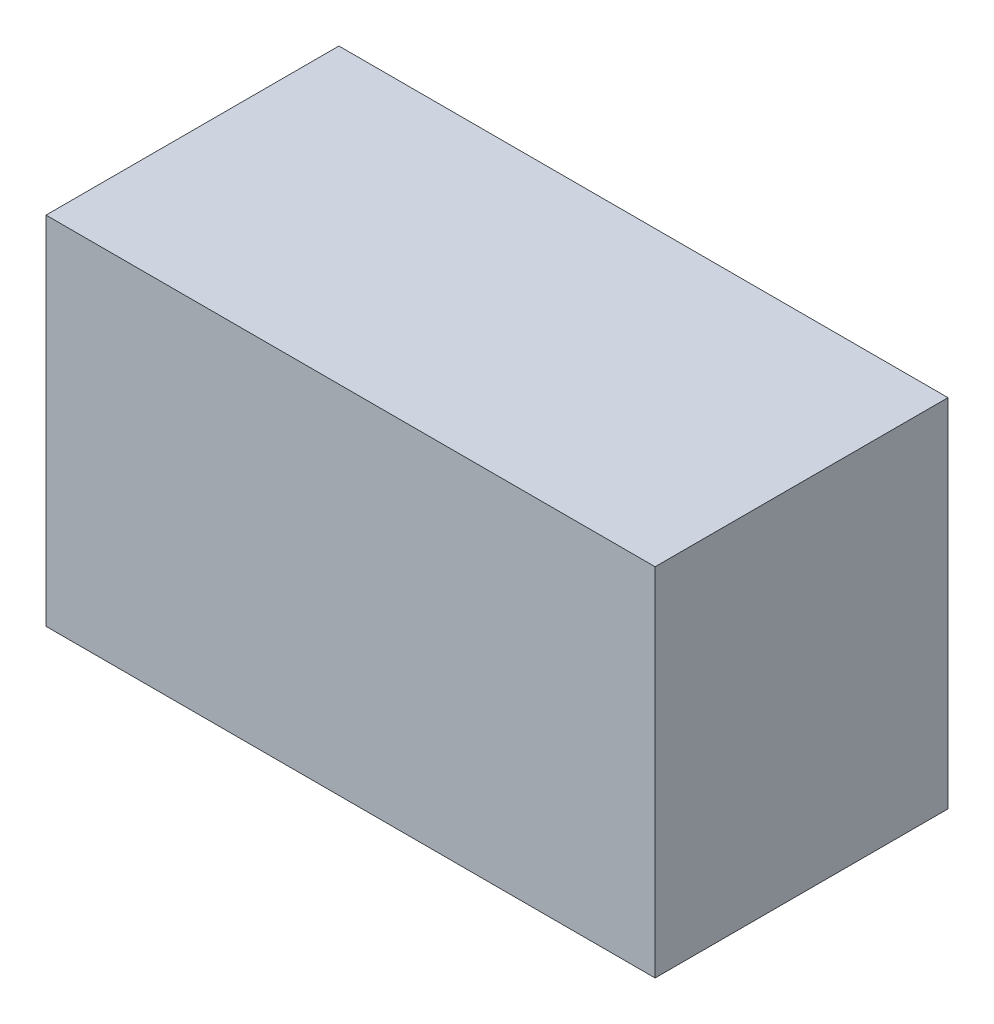
ISO-10303-21;
HEADER;
FILE_DESCRIPTION(('STEP AP214'),'2;1');
FILE_NAME('part.step','',(''),(''),'','','');
FILE_SCHEMA(('AUTOMOTIVE_DESIGN { 1 0 10303 214 1 1 1 1 }'));
ENDSEC;
DATA;
#1=APPLICATION_CONTEXT('core data for automotive mechanical design processes');
#2=APPLICATION_PROTOCOL_DEFINITION('international standard','automotive_design',2000,#1);
#3=PRODUCT_CONTEXT('',#1,'mechanical');
#4=PRODUCT('Part','Part','',(#3));
#5=PRODUCT_RELATED_PRODUCT_CATEGORY('part','',(#4));
#6=PRODUCT_DEFINITION_FORMATION('','',#4);
#7=PRODUCT_DEFINITION_CONTEXT('part definition',#1,'design');
#8=PRODUCT_DEFINITION('design','',#6,#7);
#9=PRODUCT_DEFINITION_SHAPE('','',#8);
#10=(LENGTH_UNIT() NAMED_UNIT(*) SI_UNIT(.MILLI.,.METRE.));
#11=(NAMED_UNIT(*) PLANE_ANGLE_UNIT() SI_UNIT($,.RADIAN.));
#12=(NAMED_UNIT(*) SI_UNIT($,.STERADIAN.) SOLID_ANGLE_UNIT());
#13=UNCERTAINTY_MEASURE_WITH_UNIT(LENGTH_MEASURE(1.E-05),#10,'distance_accuracy_value','');
#14=(GEOMETRIC_REPRESENTATION_CONTEXT(3) GLOBAL_UNCERTAINTY_ASSIGNED_CONTEXT((#13)) GLOBAL_UNIT_ASSIGNED_CONTEXT((#10,
#11,#12)) REPRESENTATION_CONTEXT('',''));
#15=CARTESIAN_POINT('',(0.,0.,0.));
#16=DIRECTION('',(0.,0.,1.));
#17=DIRECTION('',(1.,0.,0.));
#18=AXIS2_PLACEMENT_3D('',#15,#16,#17);
#19=CARTESIAN_POINT('',(1.0397998,-0.6079998,1.00000054));
#20=DIRECTION('',(0.,0.,1.));
#21=DIRECTION('',(1.,0.,0.));
#22=AXIS2_PLACEMENT_3D('',#19,#20,#21);
#23=PLANE('',#22);
#24=DIRECTION('',(0.,-1.,0.));
#25=VECTOR('',#24,1.);
#26=CARTESIAN_POINT('',(1.0397998,0.6079998,1.00000054));
#27=LINE('',#26,#25);
#28=CARTESIAN_POINT('',(1.0397998,0.6079998,1.00000054));
#29=VERTEX_POINT('',#28);
#30=CARTESIAN_POINT('',(1.0397998,-0.6079998,1.00000054));
#31=VERTEX_POINT('',#30);
#32=EDGE_CURVE('E27',#29,#31,#27,.T.);
#33=ORIENTED_EDGE('',*,*,#32,.F.);
#34=DIRECTION('',(0.999999999999254,-1.22138896208531E-06,0.));
#35=VECTOR('',#34,1.);
#36=CARTESIAN_POINT('',(-1.0397998,0.60800234,1.00000054));
#37=LINE('',#36,#35);
#38=CARTESIAN_POINT('',(-1.0397998,0.60800234,1.00000054));
#39=VERTEX_POINT('',#38);
#40=EDGE_CURVE('E97',#39,#29,#37,.T.);
#41=ORIENTED_EDGE('',*,*,#40,.F.);
#42=DIRECTION('',(0.,1.,0.));
#43=VECTOR('',#42,1.);
#44=CARTESIAN_POINT('',(-1.0397998,-0.60800234,1.00000054));
#45=LINE('',#44,#43);
#46=CARTESIAN_POINT('',(-1.0397998,-0.60800234,1.00000054));
#47=VERTEX_POINT('',#46);
#48=EDGE_CURVE('E74',#47,#39,#45,.T.);
#49=ORIENTED_EDGE('',*,*,#48,.F.);
#50=DIRECTION('',(-0.999999999999254,-1.22138896208531E-06,0.));
#51=VECTOR('',#50,1.);
#52=CARTESIAN_POINT('',(1.0397998,-0.6079998,1.00000054));
#53=LINE('',#52,#51);
#54=EDGE_CURVE('E78',#31,#47,#53,.T.);
#55=ORIENTED_EDGE('',*,*,#54,.F.);
#56=EDGE_LOOP('',(#33,#41,#49,#55));
#57=FACE_BOUND('',#56,.T.);
#58=ADVANCED_FACE('F16',(#57),#23,.T.);
#59=CARTESIAN_POINT('',(1.0397998,-0.6079998,0.));
#60=DIRECTION('',(0.,0.,1.));
#61=DIRECTION('',(1.,0.,0.));
#62=AXIS2_PLACEMENT_3D('',#59,#60,#61);
#63=PLANE('',#62);
#64=DIRECTION('',(-0.999999999999254,-1.22138896208531E-06,0.));
#65=VECTOR('',#64,1.);
#66=CARTESIAN_POINT('',(1.0397998,-0.6079998,0.));
#67=LINE('',#66,#65);
#68=CARTESIAN_POINT('',(1.0397998,-0.6079998,0.));
#69=VERTEX_POINT('',#68);
#70=CARTESIAN_POINT('',(-1.0397998,-0.60800234,0.));
#71=VERTEX_POINT('',#70);
#72=EDGE_CURVE('E61',#69,#71,#67,.T.);
#73=ORIENTED_EDGE('',*,*,#72,.T.);
#74=DIRECTION('',(0.,1.,0.));
#75=VECTOR('',#74,1.);
#76=CARTESIAN_POINT('',(-1.0397998,-0.60800234,0.));
#77=LINE('',#76,#75);
#78=CARTESIAN_POINT('',(-1.0397998,0.60800234,0.));
#79=VERTEX_POINT('',#78);
#80=EDGE_CURVE('E20',#71,#79,#77,.T.);
#81=ORIENTED_EDGE('',*,*,#80,.T.);
#82=DIRECTION('',(0.999999999999254,-1.22138896208531E-06,0.));
#83=VECTOR('',#82,1.);
#84=CARTESIAN_POINT('',(-1.0397998,0.60800234,0.));
#85=LINE('',#84,#83);
#86=CARTESIAN_POINT('',(1.0397998,0.6079998,0.));
#87=VERTEX_POINT('',#86);
#88=EDGE_CURVE('E64',#79,#87,#85,.T.);
#89=ORIENTED_EDGE('',*,*,#88,.T.);
#90=DIRECTION('',(0.,-1.,0.));
#91=VECTOR('',#90,1.);
#92=CARTESIAN_POINT('',(1.0397998,0.6079998,0.));
#93=LINE('',#92,#91);
#94=EDGE_CURVE('E11',#87,#69,#93,.T.);
#95=ORIENTED_EDGE('',*,*,#94,.T.);
#96=EDGE_LOOP('',(#73,#81,#89,#95));
#97=FACE_BOUND('',#96,.T.);
#98=ADVANCED_FACE('F59',(#97),#63,.F.);
#99=CARTESIAN_POINT('',(1.0397998,0.6079998,0.));
#100=DIRECTION('',(1.,0.,0.));
#101=DIRECTION('',(0.,1.,0.));
#102=AXIS2_PLACEMENT_3D('',#99,#100,#101);
#103=PLANE('',#102);
#104=DIRECTION('',(0.,0.,1.));
#105=VECTOR('',#104,1.);
#106=CARTESIAN_POINT('',(1.0397998,0.6079998,0.));
#107=LINE('',#106,#105);
#108=EDGE_CURVE('E90',#87,#29,#107,.T.);
#109=ORIENTED_EDGE('',*,*,#108,.T.);
#110=ORIENTED_EDGE('',*,*,#32,.T.);
#111=DIRECTION('',(0.,0.,1.));
#112=VECTOR('',#111,1.);
#113=CARTESIAN_POINT('',(1.0397998,-0.6079998,0.));
#114=LINE('',#113,#112);
#115=EDGE_CURVE('E70',#69,#31,#114,.T.);
#116=ORIENTED_EDGE('',*,*,#115,.F.);
#117=ORIENTED_EDGE('',*,*,#94,.F.);
#118=EDGE_LOOP('',(#109,#110,#116,#117));
#119=FACE_BOUND('',#118,.T.);
#120=ADVANCED_FACE('F76',(#119),#103,.T.);
#121=CARTESIAN_POINT('',(-1.0397998,0.60800234,0.));
#122=DIRECTION('',(1.22138896208531E-06,0.999999999999254,0.));
#123=DIRECTION('',(0.,0.,-1.));
#124=AXIS2_PLACEMENT_3D('',#121,#122,#123);
#125=PLANE('',#124);
#126=DIRECTION('',(0.,0.,1.));
#127=VECTOR('',#126,1.);
#128=CARTESIAN_POINT('',(-1.0397998,0.60800234,0.));
#129=LINE('',#128,#127);
#130=EDGE_CURVE('E85',#79,#39,#129,.T.);
#131=ORIENTED_EDGE('',*,*,#130,.T.);
#132=ORIENTED_EDGE('',*,*,#40,.T.);
#133=ORIENTED_EDGE('',*,*,#108,.F.);
#134=ORIENTED_EDGE('',*,*,#88,.F.);
#135=EDGE_LOOP('',(#131,#132,#133,#134));
#136=FACE_BOUND('',#135,.T.);
#137=ADVANCED_FACE('F115',(#136),#125,.T.);
#138=CARTESIAN_POINT('',(-1.0397998,-0.60800234,0.));
#139=DIRECTION('',(-1.,0.,0.));
#140=DIRECTION('',(0.,0.,1.));
#141=AXIS2_PLACEMENT_3D('',#138,#139,#140);
#142=PLANE('',#141);
#143=DIRECTION('',(0.,0.,1.));
#144=VECTOR('',#143,1.);
#145=CARTESIAN_POINT('',(-1.0397998,-0.60800234,0.));
#146=LINE('',#145,#144);
#147=EDGE_CURVE('E72',#71,#47,#146,.T.);
#148=ORIENTED_EDGE('',*,*,#147,.T.);
#149=ORIENTED_EDGE('',*,*,#48,.T.);
#150=ORIENTED_EDGE('',*,*,#130,.F.);
#151=ORIENTED_EDGE('',*,*,#80,.F.);
#152=EDGE_LOOP('',(#148,#149,#150,#151));
#153=FACE_BOUND('',#152,.T.);
#154=ADVANCED_FACE('F18',(#153),#142,.T.);
#155=CARTESIAN_POINT('',(1.0397998,-0.6079998,0.));
#156=DIRECTION('',(1.22138896208531E-06,-0.999999999999254,0.));
#157=DIRECTION('',(0.,0.,-1.));
#158=AXIS2_PLACEMENT_3D('',#155,#156,#157);
#159=PLANE('',#158);
#160=ORIENTED_EDGE('',*,*,#115,.T.);
#161=ORIENTED_EDGE('',*,*,#54,.T.);
#162=ORIENTED_EDGE('',*,*,#147,.F.);
#163=ORIENTED_EDGE('',*,*,#72,.F.);
#164=EDGE_LOOP('',(#160,#161,#162,#163));
#165=FACE_BOUND('',#164,.T.);
#166=ADVANCED_FACE('F68',(#165),#159,.T.);
#167=CLOSED_SHELL('',(#58,#98,#120,#137,#154,#166));
#168=MANIFOLD_SOLID_BREP('B1',#167);
#169=ADVANCED_BREP_SHAPE_REPRESENTATION('',(#18,#168),#14);
#170=SHAPE_DEFINITION_REPRESENTATION(#9,#169);
ENDSEC;
END-ISO-10303-21;
